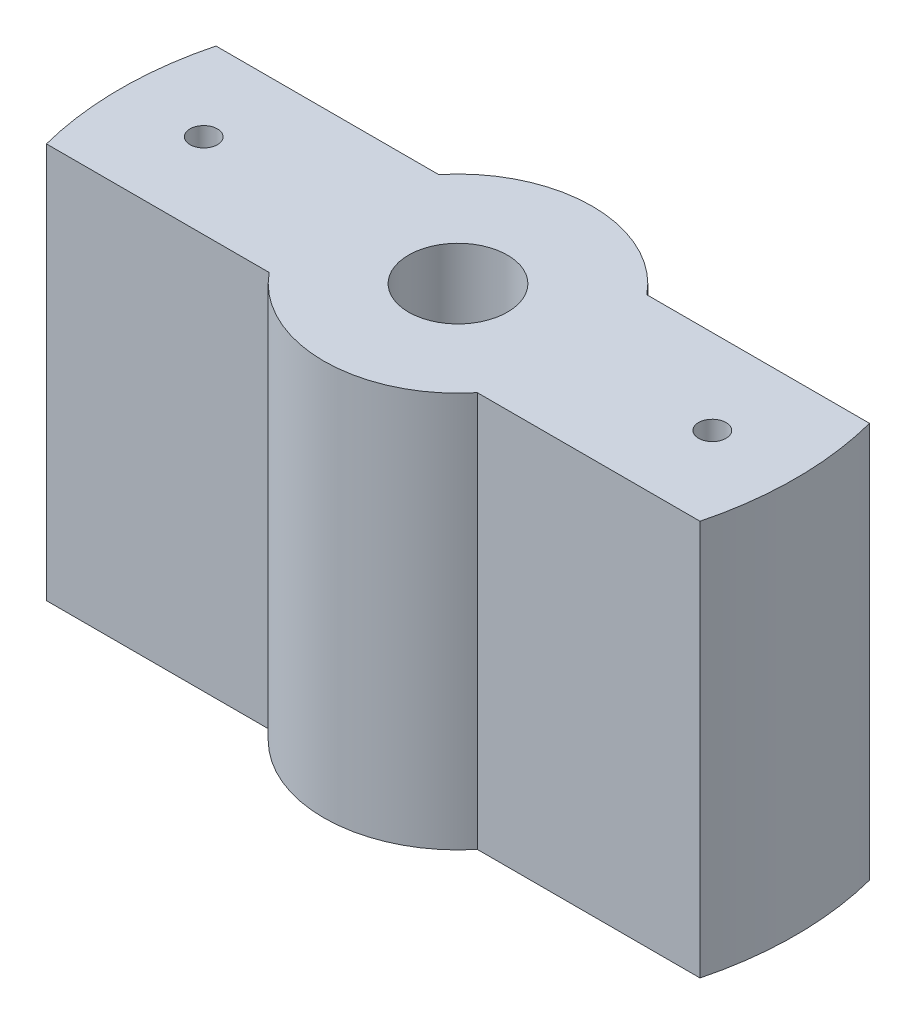
ISO-10303-21;
HEADER;
FILE_DESCRIPTION(('STEP AP214'),'2;1');
FILE_NAME('part.step','',(''),(''),'','','');
FILE_SCHEMA(('AUTOMOTIVE_DESIGN { 1 0 10303 214 1 1 1 1 }'));
ENDSEC;
DATA;
#1=APPLICATION_CONTEXT('core data for automotive mechanical design processes');
#2=APPLICATION_PROTOCOL_DEFINITION('international standard','automotive_design',2000,#1);
#3=PRODUCT_CONTEXT('',#1,'mechanical');
#4=PRODUCT('Part','Part','',(#3));
#5=PRODUCT_RELATED_PRODUCT_CATEGORY('part','',(#4));
#6=PRODUCT_DEFINITION_FORMATION('','',#4);
#7=PRODUCT_DEFINITION_CONTEXT('part definition',#1,'design');
#8=PRODUCT_DEFINITION('design','',#6,#7);
#9=PRODUCT_DEFINITION_SHAPE('','',#8);
#10=(LENGTH_UNIT() NAMED_UNIT(*) SI_UNIT(.MILLI.,.METRE.));
#11=(NAMED_UNIT(*) PLANE_ANGLE_UNIT() SI_UNIT($,.RADIAN.));
#12=(NAMED_UNIT(*) SI_UNIT($,.STERADIAN.) SOLID_ANGLE_UNIT());
#13=UNCERTAINTY_MEASURE_WITH_UNIT(LENGTH_MEASURE(1.E-05),#10,'distance_accuracy_value','');
#14=(GEOMETRIC_REPRESENTATION_CONTEXT(3) GLOBAL_UNCERTAINTY_ASSIGNED_CONTEXT((#13)) GLOBAL_UNIT_ASSIGNED_CONTEXT((#10,
#11,#12)) REPRESENTATION_CONTEXT('',''));
#15=CARTESIAN_POINT('',(0.,0.,0.));
#16=DIRECTION('',(0.,0.,1.));
#17=DIRECTION('',(1.,0.,0.));
#18=AXIS2_PLACEMENT_3D('',#15,#16,#17);
#19=CARTESIAN_POINT('',(0.,88.9,-5.8634354494623));
#20=DIRECTION('',(0.,1.,0.));
#21=DIRECTION('',(0.,0.,1.));
#22=AXIS2_PLACEMENT_3D('',#19,#20,#21);
#23=PLANE('',#22);
#24=CARTESIAN_POINT('',(-57.15,88.9,-5.8634354494623));
#25=DIRECTION('',(0.,1.,0.));
#26=DIRECTION('',(0.,0.,1.));
#27=AXIS2_PLACEMENT_3D('',#24,#25,#26);
#28=CIRCLE('',#27,3.08402244808117);
#29=CARTESIAN_POINT('',(-57.15,88.9,-2.77941300138113));
#30=VERTEX_POINT('',#29);
#31=EDGE_CURVE('E215',#30,#30,#28,.T.);
#32=ORIENTED_EDGE('',*,*,#31,.F.);
#33=EDGE_LOOP('',(#32));
#34=FACE_BOUND('',#33,.T.);
#35=CARTESIAN_POINT('',(0.,88.9,-5.8634354494623));
#36=DIRECTION('',(0.,1.,0.));
#37=DIRECTION('',(0.,0.,1.));
#38=AXIS2_PLACEMENT_3D('',#35,#36,#37);
#39=CIRCLE('',#38,75.8698);
#40=CARTESIAN_POINT('',(73.4392541631518,88.9,13.1865645505376));
#41=VERTEX_POINT('',#40);
#42=CARTESIAN_POINT('',(73.4392541631517,88.9,-24.9134354494624));
#43=VERTEX_POINT('',#42);
#44=EDGE_CURVE('E166',#41,#43,#39,.T.);
#45=ORIENTED_EDGE('',*,*,#44,.T.);
#46=DIRECTION('',(-1.,0.,0.));
#47=VECTOR('',#46,1.);
#48=CARTESIAN_POINT('',(73.4392541631517,88.9,-24.9134354494624));
#49=LINE('',#48,#47);
#50=CARTESIAN_POINT('',(23.3853352819667,88.9,-24.9134354494623));
#51=VERTEX_POINT('',#50);
#52=EDGE_CURVE('E101',#43,#51,#49,.T.);
#53=ORIENTED_EDGE('',*,*,#52,.T.);
#54=CARTESIAN_POINT('',(0.,88.9,-5.8634354494623));
#55=DIRECTION('',(0.,1.,0.));
#56=DIRECTION('',(0.,0.,1.));
#57=AXIS2_PLACEMENT_3D('',#54,#55,#56);
#58=CIRCLE('',#57,30.1625);
#59=CARTESIAN_POINT('',(-23.3853352819667,88.9,-24.9134354494623));
#60=VERTEX_POINT('',#59);
#61=EDGE_CURVE('E187',#51,#60,#58,.T.);
#62=ORIENTED_EDGE('',*,*,#61,.T.);
#63=DIRECTION('',(-1.,0.,0.));
#64=VECTOR('',#63,1.);
#65=CARTESIAN_POINT('',(-23.3853352819667,88.9,-24.9134354494623));
#66=LINE('',#65,#64);
#67=CARTESIAN_POINT('',(-73.4392541631517,88.9,-24.9134354494623));
#68=VERTEX_POINT('',#67);
#69=EDGE_CURVE('E201',#60,#68,#66,.T.);
#70=ORIENTED_EDGE('',*,*,#69,.T.);
#71=CARTESIAN_POINT('',(0.,88.9,-5.8634354494623));
#72=DIRECTION('',(0.,1.,0.));
#73=DIRECTION('',(0.,0.,1.));
#74=AXIS2_PLACEMENT_3D('',#71,#72,#73);
#75=CIRCLE('',#74,75.8698);
#76=CARTESIAN_POINT('',(-73.4392541631517,88.9,13.1865645505377));
#77=VERTEX_POINT('',#76);
#78=EDGE_CURVE('E120',#68,#77,#75,.T.);
#79=ORIENTED_EDGE('',*,*,#78,.T.);
#80=DIRECTION('',(1.,0.,0.));
#81=VECTOR('',#80,1.);
#82=CARTESIAN_POINT('',(-23.3853352819668,88.9,13.1865645505377));
#83=LINE('',#82,#81);
#84=CARTESIAN_POINT('',(-23.3853352819668,88.9,13.1865645505377));
#85=VERTEX_POINT('',#84);
#86=EDGE_CURVE('E114',#77,#85,#83,.T.);
#87=ORIENTED_EDGE('',*,*,#86,.T.);
#88=CARTESIAN_POINT('',(0.,88.9,-5.8634354494623));
#89=DIRECTION('',(0.,1.,0.));
#90=DIRECTION('',(0.,0.,1.));
#91=AXIS2_PLACEMENT_3D('',#88,#89,#90);
#92=CIRCLE('',#91,30.1625);
#93=CARTESIAN_POINT('',(23.3853352819668,88.9,13.1865645505377));
#94=VERTEX_POINT('',#93);
#95=EDGE_CURVE('E118',#85,#94,#92,.T.);
#96=ORIENTED_EDGE('',*,*,#95,.T.);
#97=DIRECTION('',(1.,0.,0.));
#98=VECTOR('',#97,1.);
#99=CARTESIAN_POINT('',(73.4392541631518,88.9,13.1865645505376));
#100=LINE('',#99,#98);
#101=EDGE_CURVE('E58',#94,#41,#100,.T.);
#102=ORIENTED_EDGE('',*,*,#101,.T.);
#103=EDGE_LOOP('',(#45,#53,#62,#70,#79,#87,#96,#102));
#104=FACE_BOUND('',#103,.T.);
#105=CARTESIAN_POINT('',(0.,88.9,-5.8634354494623));
#106=DIRECTION('',(0.,1.,0.));
#107=DIRECTION('',(0.,0.,1.));
#108=AXIS2_PLACEMENT_3D('',#105,#106,#107);
#109=CIRCLE('',#108,11.1125);
#110=CARTESIAN_POINT('',(0.,88.9,5.2490645505377));
#111=VERTEX_POINT('',#110);
#112=EDGE_CURVE('E149',#111,#111,#109,.T.);
#113=ORIENTED_EDGE('',*,*,#112,.F.);
#114=EDGE_LOOP('',(#113));
#115=FACE_BOUND('',#114,.T.);
#116=CARTESIAN_POINT('',(57.15,88.9,-5.86343544946236));
#117=DIRECTION('',(0.,1.,0.));
#118=DIRECTION('',(0.,0.,-1.));
#119=AXIS2_PLACEMENT_3D('',#116,#117,#118);
#120=CIRCLE('',#119,3.08402244808117);
#121=CARTESIAN_POINT('',(57.15,88.9,-8.94745789754353));
#122=VERTEX_POINT('',#121);
#123=EDGE_CURVE('E223',#122,#122,#120,.T.);
#124=ORIENTED_EDGE('',*,*,#123,.F.);
#125=EDGE_LOOP('',(#124));
#126=FACE_BOUND('',#125,.T.);
#127=ADVANCED_FACE('F40',(#34,#104,#115,#126),#23,.T.);
#128=CARTESIAN_POINT('',(0.,0.,-5.8634354494623));
#129=DIRECTION('',(0.,1.,0.));
#130=DIRECTION('',(0.,0.,1.));
#131=AXIS2_PLACEMENT_3D('',#128,#129,#130);
#132=PLANE('',#131);
#133=CARTESIAN_POINT('',(-57.15,0.,-5.8634354494623));
#134=DIRECTION('',(0.,1.,0.));
#135=DIRECTION('',(0.,0.,1.));
#136=AXIS2_PLACEMENT_3D('',#133,#134,#135);
#137=CIRCLE('',#136,3.08402244808117);
#138=CARTESIAN_POINT('',(-57.15,0.,-2.77941300138113));
#139=VERTEX_POINT('',#138);
#140=EDGE_CURVE('E219',#139,#139,#137,.T.);
#141=ORIENTED_EDGE('',*,*,#140,.T.);
#142=EDGE_LOOP('',(#141));
#143=FACE_BOUND('',#142,.T.);
#144=CARTESIAN_POINT('',(0.,0.,-5.8634354494623));
#145=DIRECTION('',(0.,1.,0.));
#146=DIRECTION('',(0.,0.,1.));
#147=AXIS2_PLACEMENT_3D('',#144,#145,#146);
#148=CIRCLE('',#147,75.8698);
#149=CARTESIAN_POINT('',(73.4392541631518,0.,13.1865645505376));
#150=VERTEX_POINT('',#149);
#151=CARTESIAN_POINT('',(73.4392541631517,0.,-24.9134354494624));
#152=VERTEX_POINT('',#151);
#153=EDGE_CURVE('E144',#150,#152,#148,.T.);
#154=ORIENTED_EDGE('',*,*,#153,.F.);
#155=DIRECTION('',(1.,0.,0.));
#156=VECTOR('',#155,1.);
#157=CARTESIAN_POINT('',(73.4392541631518,0.,13.1865645505376));
#158=LINE('',#157,#156);
#159=CARTESIAN_POINT('',(23.3853352819668,0.,13.1865645505377));
#160=VERTEX_POINT('',#159);
#161=EDGE_CURVE('E93',#160,#150,#158,.T.);
#162=ORIENTED_EDGE('',*,*,#161,.F.);
#163=CARTESIAN_POINT('',(0.,0.,-5.8634354494623));
#164=DIRECTION('',(0.,1.,0.));
#165=DIRECTION('',(0.,0.,1.));
#166=AXIS2_PLACEMENT_3D('',#163,#164,#165);
#167=CIRCLE('',#166,30.1625);
#168=CARTESIAN_POINT('',(-23.3853352819668,0.,13.1865645505377));
#169=VERTEX_POINT('',#168);
#170=EDGE_CURVE('E87',#169,#160,#167,.T.);
#171=ORIENTED_EDGE('',*,*,#170,.F.);
#172=DIRECTION('',(1.,0.,0.));
#173=VECTOR('',#172,1.);
#174=CARTESIAN_POINT('',(-23.3853352819668,0.,13.1865645505377));
#175=LINE('',#174,#173);
#176=CARTESIAN_POINT('',(-73.4392541631517,0.,13.1865645505377));
#177=VERTEX_POINT('',#176);
#178=EDGE_CURVE('E129',#177,#169,#175,.T.);
#179=ORIENTED_EDGE('',*,*,#178,.F.);
#180=CARTESIAN_POINT('',(0.,0.,-5.8634354494623));
#181=DIRECTION('',(0.,1.,0.));
#182=DIRECTION('',(0.,0.,1.));
#183=AXIS2_PLACEMENT_3D('',#180,#181,#182);
#184=CIRCLE('',#183,75.8698);
#185=CARTESIAN_POINT('',(-73.4392541631517,0.,-24.9134354494623));
#186=VERTEX_POINT('',#185);
#187=EDGE_CURVE('E157',#186,#177,#184,.T.);
#188=ORIENTED_EDGE('',*,*,#187,.F.);
#189=DIRECTION('',(-1.,0.,0.));
#190=VECTOR('',#189,1.);
#191=CARTESIAN_POINT('',(-23.3853352819667,0.,-24.9134354494623));
#192=LINE('',#191,#190);
#193=CARTESIAN_POINT('',(-23.3853352819667,0.,-24.9134354494623));
#194=VERTEX_POINT('',#193);
#195=EDGE_CURVE('E154',#194,#186,#192,.T.);
#196=ORIENTED_EDGE('',*,*,#195,.F.);
#197=CARTESIAN_POINT('',(0.,0.,-5.8634354494623));
#198=DIRECTION('',(0.,1.,0.));
#199=DIRECTION('',(0.,0.,1.));
#200=AXIS2_PLACEMENT_3D('',#197,#198,#199);
#201=CIRCLE('',#200,30.1625);
#202=CARTESIAN_POINT('',(23.3853352819667,0.,-24.9134354494623));
#203=VERTEX_POINT('',#202);
#204=EDGE_CURVE('E152',#203,#194,#201,.T.);
#205=ORIENTED_EDGE('',*,*,#204,.F.);
#206=DIRECTION('',(-1.,0.,0.));
#207=VECTOR('',#206,1.);
#208=CARTESIAN_POINT('',(73.4392541631517,0.,-24.9134354494624));
#209=LINE('',#208,#207);
#210=EDGE_CURVE('E148',#152,#203,#209,.T.);
#211=ORIENTED_EDGE('',*,*,#210,.F.);
#212=EDGE_LOOP('',(#154,#162,#171,#179,#188,#196,#205,#211));
#213=FACE_BOUND('',#212,.T.);
#214=CARTESIAN_POINT('',(0.,0.,-5.8634354494623));
#215=DIRECTION('',(0.,1.,0.));
#216=DIRECTION('',(0.,0.,1.));
#217=AXIS2_PLACEMENT_3D('',#214,#215,#216);
#218=CIRCLE('',#217,11.1125);
#219=CARTESIAN_POINT('',(0.,0.,5.2490645505377));
#220=VERTEX_POINT('',#219);
#221=EDGE_CURVE('E211',#220,#220,#218,.T.);
#222=ORIENTED_EDGE('',*,*,#221,.T.);
#223=EDGE_LOOP('',(#222));
#224=FACE_BOUND('',#223,.T.);
#225=CARTESIAN_POINT('',(57.15,0.,-5.86343544946236));
#226=DIRECTION('',(0.,1.,0.));
#227=DIRECTION('',(0.,0.,-1.));
#228=AXIS2_PLACEMENT_3D('',#225,#226,#227);
#229=CIRCLE('',#228,3.08402244808117);
#230=CARTESIAN_POINT('',(57.15,0.,-8.94745789754353));
#231=VERTEX_POINT('',#230);
#232=EDGE_CURVE('E227',#231,#231,#229,.T.);
#233=ORIENTED_EDGE('',*,*,#232,.T.);
#234=EDGE_LOOP('',(#233));
#235=FACE_BOUND('',#234,.T.);
#236=ADVANCED_FACE('F191',(#143,#213,#224,#235),#132,.F.);
#237=CARTESIAN_POINT('',(0.,88.9,-5.8634354494623));
#238=DIRECTION('',(0.,-1.,0.));
#239=DIRECTION('',(0.,0.,-1.));
#240=AXIS2_PLACEMENT_3D('',#237,#238,#239);
#241=CYLINDRICAL_SURFACE('',#240,75.8698);
#242=ORIENTED_EDGE('',*,*,#153,.T.);
#243=DIRECTION('',(0.,-1.,0.));
#244=VECTOR('',#243,1.);
#245=CARTESIAN_POINT('',(73.4392541631517,88.9,-24.9134354494624));
#246=LINE('',#245,#244);
#247=EDGE_CURVE('E11',#43,#152,#246,.T.);
#248=ORIENTED_EDGE('',*,*,#247,.F.);
#249=ORIENTED_EDGE('',*,*,#44,.F.);
#250=DIRECTION('',(0.,-1.,0.));
#251=VECTOR('',#250,1.);
#252=CARTESIAN_POINT('',(73.4392541631518,88.9,13.1865645505376));
#253=LINE('',#252,#251);
#254=EDGE_CURVE('E140',#41,#150,#253,.T.);
#255=ORIENTED_EDGE('',*,*,#254,.T.);
#256=EDGE_LOOP('',(#242,#248,#249,#255));
#257=FACE_BOUND('',#256,.T.);
#258=ADVANCED_FACE('F42',(#257),#241,.T.);
#259=CARTESIAN_POINT('',(73.4392541631517,88.9,-24.9134354494624));
#260=DIRECTION('',(0.,0.,1.));
#261=DIRECTION('',(1.,0.,0.));
#262=AXIS2_PLACEMENT_3D('',#259,#260,#261);
#263=PLANE('',#262);
#264=ORIENTED_EDGE('',*,*,#210,.T.);
#265=DIRECTION('',(0.,-1.,0.));
#266=VECTOR('',#265,1.);
#267=CARTESIAN_POINT('',(23.3853352819667,88.9,-24.9134354494623));
#268=LINE('',#267,#266);
#269=EDGE_CURVE('E50',#51,#203,#268,.T.);
#270=ORIENTED_EDGE('',*,*,#269,.F.);
#271=ORIENTED_EDGE('',*,*,#52,.F.);
#272=ORIENTED_EDGE('',*,*,#247,.T.);
#273=EDGE_LOOP('',(#264,#270,#271,#272));
#274=FACE_BOUND('',#273,.T.);
#275=ADVANCED_FACE('F261',(#274),#263,.F.);
#276=CARTESIAN_POINT('',(0.,88.9,-5.8634354494623));
#277=DIRECTION('',(0.,-1.,0.));
#278=DIRECTION('',(0.,0.,-1.));
#279=AXIS2_PLACEMENT_3D('',#276,#277,#278);
#280=CYLINDRICAL_SURFACE('',#279,30.1625);
#281=ORIENTED_EDGE('',*,*,#204,.T.);
#282=DIRECTION('',(0.,-1.,0.));
#283=VECTOR('',#282,1.);
#284=CARTESIAN_POINT('',(-23.3853352819667,88.9,-24.9134354494623));
#285=LINE('',#284,#283);
#286=EDGE_CURVE('E177',#60,#194,#285,.T.);
#287=ORIENTED_EDGE('',*,*,#286,.F.);
#288=ORIENTED_EDGE('',*,*,#61,.F.);
#289=ORIENTED_EDGE('',*,*,#269,.T.);
#290=EDGE_LOOP('',(#281,#287,#288,#289));
#291=FACE_BOUND('',#290,.T.);
#292=ADVANCED_FACE('F185',(#291),#280,.T.);
#293=CARTESIAN_POINT('',(-23.3853352819667,88.9,-24.9134354494623));
#294=DIRECTION('',(0.,0.,1.));
#295=DIRECTION('',(1.,0.,0.));
#296=AXIS2_PLACEMENT_3D('',#293,#294,#295);
#297=PLANE('',#296);
#298=ORIENTED_EDGE('',*,*,#195,.T.);
#299=DIRECTION('',(0.,-1.,0.));
#300=VECTOR('',#299,1.);
#301=CARTESIAN_POINT('',(-73.4392541631517,88.9,-24.9134354494623));
#302=LINE('',#301,#300);
#303=EDGE_CURVE('E173',#68,#186,#302,.T.);
#304=ORIENTED_EDGE('',*,*,#303,.F.);
#305=ORIENTED_EDGE('',*,*,#69,.F.);
#306=ORIENTED_EDGE('',*,*,#286,.T.);
#307=EDGE_LOOP('',(#298,#304,#305,#306));
#308=FACE_BOUND('',#307,.T.);
#309=ADVANCED_FACE('F196',(#308),#297,.F.);
#310=CARTESIAN_POINT('',(0.,88.9,-5.8634354494623));
#311=DIRECTION('',(0.,-1.,0.));
#312=DIRECTION('',(0.,0.,-1.));
#313=AXIS2_PLACEMENT_3D('',#310,#311,#312);
#314=CYLINDRICAL_SURFACE('',#313,75.8698);
#315=ORIENTED_EDGE('',*,*,#187,.T.);
#316=DIRECTION('',(0.,-1.,0.));
#317=VECTOR('',#316,1.);
#318=CARTESIAN_POINT('',(-73.4392541631517,88.9,13.1865645505377));
#319=LINE('',#318,#317);
#320=EDGE_CURVE('E131',#77,#177,#319,.T.);
#321=ORIENTED_EDGE('',*,*,#320,.F.);
#322=ORIENTED_EDGE('',*,*,#78,.F.);
#323=ORIENTED_EDGE('',*,*,#303,.T.);
#324=EDGE_LOOP('',(#315,#321,#322,#323));
#325=FACE_BOUND('',#324,.T.);
#326=ADVANCED_FACE('F199',(#325),#314,.T.);
#327=CARTESIAN_POINT('',(-23.3853352819668,88.9,13.1865645505377));
#328=DIRECTION('',(0.,0.,-1.));
#329=DIRECTION('',(-1.,0.,0.));
#330=AXIS2_PLACEMENT_3D('',#327,#328,#329);
#331=PLANE('',#330);
#332=ORIENTED_EDGE('',*,*,#178,.T.);
#333=DIRECTION('',(0.,-1.,0.));
#334=VECTOR('',#333,1.);
#335=CARTESIAN_POINT('',(-23.3853352819668,88.9,13.1865645505377));
#336=LINE('',#335,#334);
#337=EDGE_CURVE('E126',#85,#169,#336,.T.);
#338=ORIENTED_EDGE('',*,*,#337,.F.);
#339=ORIENTED_EDGE('',*,*,#86,.F.);
#340=ORIENTED_EDGE('',*,*,#320,.T.);
#341=EDGE_LOOP('',(#332,#338,#339,#340));
#342=FACE_BOUND('',#341,.T.);
#343=ADVANCED_FACE('F127',(#342),#331,.F.);
#344=CARTESIAN_POINT('',(0.,88.9,-5.8634354494623));
#345=DIRECTION('',(0.,-1.,0.));
#346=DIRECTION('',(0.,0.,-1.));
#347=AXIS2_PLACEMENT_3D('',#344,#345,#346);
#348=CYLINDRICAL_SURFACE('',#347,30.1625);
#349=ORIENTED_EDGE('',*,*,#170,.T.);
#350=DIRECTION('',(0.,-1.,0.));
#351=VECTOR('',#350,1.);
#352=CARTESIAN_POINT('',(23.3853352819668,88.9,13.1865645505377));
#353=LINE('',#352,#351);
#354=EDGE_CURVE('E132',#94,#160,#353,.T.);
#355=ORIENTED_EDGE('',*,*,#354,.F.);
#356=ORIENTED_EDGE('',*,*,#95,.F.);
#357=ORIENTED_EDGE('',*,*,#337,.T.);
#358=EDGE_LOOP('',(#349,#355,#356,#357));
#359=FACE_BOUND('',#358,.T.);
#360=ADVANCED_FACE('F134',(#359),#348,.T.);
#361=CARTESIAN_POINT('',(73.4392541631518,88.9,13.1865645505376));
#362=DIRECTION('',(0.,0.,-1.));
#363=DIRECTION('',(-1.,0.,0.));
#364=AXIS2_PLACEMENT_3D('',#361,#362,#363);
#365=PLANE('',#364);
#366=ORIENTED_EDGE('',*,*,#161,.T.);
#367=ORIENTED_EDGE('',*,*,#254,.F.);
#368=ORIENTED_EDGE('',*,*,#101,.F.);
#369=ORIENTED_EDGE('',*,*,#354,.T.);
#370=EDGE_LOOP('',(#366,#367,#368,#369));
#371=FACE_BOUND('',#370,.T.);
#372=ADVANCED_FACE('F249',(#371),#365,.F.);
#373=CARTESIAN_POINT('',(0.,88.9,-5.8634354494623));
#374=DIRECTION('',(0.,-1.,0.));
#375=DIRECTION('',(0.,0.,-1.));
#376=AXIS2_PLACEMENT_3D('',#373,#374,#375);
#377=CYLINDRICAL_SURFACE('',#376,11.1125);
#378=ORIENTED_EDGE('',*,*,#112,.T.);
#379=EDGE_LOOP('',(#378));
#380=FACE_BOUND('',#379,.T.);
#381=ORIENTED_EDGE('',*,*,#221,.F.);
#382=EDGE_LOOP('',(#381));
#383=FACE_BOUND('',#382,.T.);
#384=ADVANCED_FACE('F246',(#380,#383),#377,.F.);
#385=CARTESIAN_POINT('',(-57.15,88.9,-5.8634354494623));
#386=DIRECTION('',(0.,-1.,0.));
#387=DIRECTION('',(0.,0.,-1.));
#388=AXIS2_PLACEMENT_3D('',#385,#386,#387);
#389=CYLINDRICAL_SURFACE('',#388,3.08402244808117);
#390=ORIENTED_EDGE('',*,*,#31,.T.);
#391=EDGE_LOOP('',(#390));
#392=FACE_BOUND('',#391,.T.);
#393=ORIENTED_EDGE('',*,*,#140,.F.);
#394=EDGE_LOOP('',(#393));
#395=FACE_BOUND('',#394,.T.);
#396=ADVANCED_FACE('F335',(#392,#395),#389,.F.);
#397=CARTESIAN_POINT('',(57.15,88.9,-5.86343544946236));
#398=DIRECTION('',(0.,-1.,0.));
#399=DIRECTION('',(0.,0.,-1.));
#400=AXIS2_PLACEMENT_3D('',#397,#398,#399);
#401=CYLINDRICAL_SURFACE('',#400,3.08402244808117);
#402=ORIENTED_EDGE('',*,*,#123,.T.);
#403=EDGE_LOOP('',(#402));
#404=FACE_BOUND('',#403,.T.);
#405=ORIENTED_EDGE('',*,*,#232,.F.);
#406=EDGE_LOOP('',(#405));
#407=FACE_BOUND('',#406,.T.);
#408=ADVANCED_FACE('F234',(#404,#407),#401,.F.);
#409=CLOSED_SHELL('',(#127,#236,#258,#275,#292,#309,#326,#343,#360,#372,#384,#396,#408));
#410=MANIFOLD_SOLID_BREP('B2',#409);
#411=ADVANCED_BREP_SHAPE_REPRESENTATION('',(#18,#410),#14);
#412=SHAPE_DEFINITION_REPRESENTATION(#9,#411);
ENDSEC;
END-ISO-10303-21;
